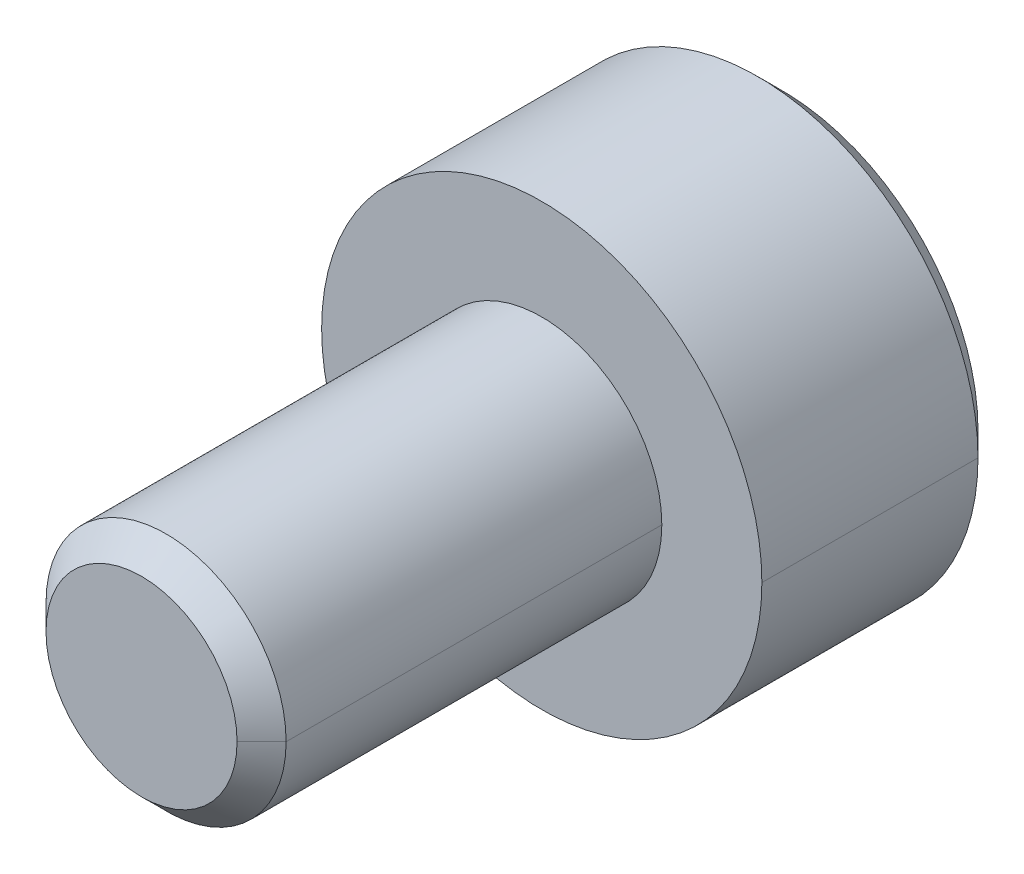
ISO-10303-21;
HEADER;
FILE_DESCRIPTION(('STEP AP214'),'2;1');
FILE_NAME('part.step','',(''),(''),'','','');
FILE_SCHEMA(('AUTOMOTIVE_DESIGN { 1 0 10303 214 1 1 1 1 }'));
ENDSEC;
DATA;
#1=APPLICATION_CONTEXT('core data for automotive mechanical design processes');
#2=APPLICATION_PROTOCOL_DEFINITION('international standard','automotive_design',2000,#1);
#3=PRODUCT_CONTEXT('',#1,'mechanical');
#4=PRODUCT('Part','Part','',(#3));
#5=PRODUCT_RELATED_PRODUCT_CATEGORY('part','',(#4));
#6=PRODUCT_DEFINITION_FORMATION('','',#4);
#7=PRODUCT_DEFINITION_CONTEXT('part definition',#1,'design');
#8=PRODUCT_DEFINITION('design','',#6,#7);
#9=PRODUCT_DEFINITION_SHAPE('','',#8);
#10=(LENGTH_UNIT() NAMED_UNIT(*) SI_UNIT(.MILLI.,.METRE.));
#11=(NAMED_UNIT(*) PLANE_ANGLE_UNIT() SI_UNIT($,.RADIAN.));
#12=(NAMED_UNIT(*) SI_UNIT($,.STERADIAN.) SOLID_ANGLE_UNIT());
#13=UNCERTAINTY_MEASURE_WITH_UNIT(LENGTH_MEASURE(1.E-05),#10,'distance_accuracy_value','');
#14=(GEOMETRIC_REPRESENTATION_CONTEXT(3) GLOBAL_UNCERTAINTY_ASSIGNED_CONTEXT((#13)) GLOBAL_UNIT_ASSIGNED_CONTEXT((#10,
#11,#12)) REPRESENTATION_CONTEXT('',''));
#15=CARTESIAN_POINT('',(0.,0.,0.));
#16=DIRECTION('',(0.,0.,1.));
#17=DIRECTION('',(1.,0.,0.));
#18=AXIS2_PLACEMENT_3D('',#15,#16,#17);
#19=CARTESIAN_POINT('',(0.,0.,1.3));
#20=DIRECTION('',(0.,0.,-1.));
#21=DIRECTION('',(0.,-1.,0.));
#22=AXIS2_PLACEMENT_3D('',#19,#20,#21);
#23=PLANE('',#22);
#24=DIRECTION('',(0.866025403784439,0.5,0.));
#25=VECTOR('',#24,1.);
#26=CARTESIAN_POINT('',(-1.25,0.721687836487033,1.3));
#27=LINE('',#26,#25);
#28=CARTESIAN_POINT('',(-1.25,0.721687836487033,1.3));
#29=VERTEX_POINT('',#28);
#30=CARTESIAN_POINT('',(0.,1.44337567297406,1.3));
#31=VERTEX_POINT('',#30);
#32=EDGE_CURVE('E251',#29,#31,#27,.T.);
#33=ORIENTED_EDGE('',*,*,#32,.T.);
#34=DIRECTION('',(0.866025403784439,-0.5,0.));
#35=VECTOR('',#34,1.);
#36=CARTESIAN_POINT('',(0.,1.44337567297406,1.3));
#37=LINE('',#36,#35);
#38=CARTESIAN_POINT('',(1.25,0.721687836487033,1.3));
#39=VERTEX_POINT('',#38);
#40=EDGE_CURVE('E9',#31,#39,#37,.T.);
#41=ORIENTED_EDGE('',*,*,#40,.T.);
#42=DIRECTION('',(0.,-1.,0.));
#43=VECTOR('',#42,1.);
#44=CARTESIAN_POINT('',(1.25,0.721687836487033,1.3));
#45=LINE('',#44,#43);
#46=CARTESIAN_POINT('',(1.25,-0.721687836487033,1.3));
#47=VERTEX_POINT('',#46);
#48=EDGE_CURVE('E42',#39,#47,#45,.T.);
#49=ORIENTED_EDGE('',*,*,#48,.T.);
#50=DIRECTION('',(-0.866025403784439,-0.5,0.));
#51=VECTOR('',#50,1.);
#52=CARTESIAN_POINT('',(1.25,-0.721687836487033,1.3));
#53=LINE('',#52,#51);
#54=CARTESIAN_POINT('',(0.,-1.44337567297406,1.3));
#55=VERTEX_POINT('',#54);
#56=EDGE_CURVE('E264',#47,#55,#53,.T.);
#57=ORIENTED_EDGE('',*,*,#56,.T.);
#58=DIRECTION('',(-0.866025403784439,0.5,0.));
#59=VECTOR('',#58,1.);
#60=CARTESIAN_POINT('',(0.,-1.44337567297406,1.3));
#61=LINE('',#60,#59);
#62=CARTESIAN_POINT('',(-1.25,-0.721687836487033,1.3));
#63=VERTEX_POINT('',#62);
#64=EDGE_CURVE('E258',#55,#63,#61,.T.);
#65=ORIENTED_EDGE('',*,*,#64,.T.);
#66=DIRECTION('',(0.,1.,0.));
#67=VECTOR('',#66,1.);
#68=CARTESIAN_POINT('',(-1.25,-0.721687836487033,1.3));
#69=LINE('',#68,#67);
#70=EDGE_CURVE('E210',#63,#29,#69,.T.);
#71=ORIENTED_EDGE('',*,*,#70,.T.);
#72=EDGE_LOOP('',(#33,#41,#49,#57,#65,#71));
#73=FACE_BOUND('',#72,.T.);
#74=ADVANCED_FACE('F15',(#73),#23,.T.);
#75=CARTESIAN_POINT('',(0.,1.44337567297406,1.3));
#76=DIRECTION('',(0.5,0.866025403784439,0.));
#77=DIRECTION('',(0.,0.,-1.));
#78=AXIS2_PLACEMENT_3D('',#75,#76,#77);
#79=PLANE('',#78);
#80=DIRECTION('',(0.866025403784439,-0.5,0.));
#81=VECTOR('',#80,1.);
#82=CARTESIAN_POINT('',(0.,1.44337567297406,0.));
#83=LINE('',#82,#81);
#84=CARTESIAN_POINT('',(0.,1.44337567297406,0.));
#85=VERTEX_POINT('',#84);
#86=CARTESIAN_POINT('',(1.25,0.721687836487033,0.));
#87=VERTEX_POINT('',#86);
#88=EDGE_CURVE('E228',#85,#87,#83,.T.);
#89=ORIENTED_EDGE('',*,*,#88,.T.);
#90=DIRECTION('',(0.,0.,-1.));
#91=VECTOR('',#90,1.);
#92=CARTESIAN_POINT('',(1.25,0.721687836487033,1.3));
#93=LINE('',#92,#91);
#94=EDGE_CURVE('E23',#39,#87,#93,.T.);
#95=ORIENTED_EDGE('',*,*,#94,.F.);
#96=ORIENTED_EDGE('',*,*,#40,.F.);
#97=DIRECTION('',(0.,0.,-1.));
#98=VECTOR('',#97,1.);
#99=CARTESIAN_POINT('',(0.,1.44337567297406,1.3));
#100=LINE('',#99,#98);
#101=EDGE_CURVE('E142',#31,#85,#100,.T.);
#102=ORIENTED_EDGE('',*,*,#101,.T.);
#103=EDGE_LOOP('',(#89,#95,#96,#102));
#104=FACE_BOUND('',#103,.T.);
#105=ADVANCED_FACE('F285',(#104),#79,.F.);
#106=CARTESIAN_POINT('',(1.25,0.721687836487033,1.3));
#107=DIRECTION('',(1.,0.,0.));
#108=DIRECTION('',(0.,1.,0.));
#109=AXIS2_PLACEMENT_3D('',#106,#107,#108);
#110=PLANE('',#109);
#111=DIRECTION('',(0.,-1.,0.));
#112=VECTOR('',#111,1.);
#113=CARTESIAN_POINT('',(1.25,0.721687836487033,0.));
#114=LINE('',#113,#112);
#115=CARTESIAN_POINT('',(1.25,-0.721687836487033,0.));
#116=VERTEX_POINT('',#115);
#117=EDGE_CURVE('E218',#87,#116,#114,.T.);
#118=ORIENTED_EDGE('',*,*,#117,.T.);
#119=DIRECTION('',(0.,0.,-1.));
#120=VECTOR('',#119,1.);
#121=CARTESIAN_POINT('',(1.25,-0.721687836487033,1.3));
#122=LINE('',#121,#120);
#123=EDGE_CURVE('E267',#47,#116,#122,.T.);
#124=ORIENTED_EDGE('',*,*,#123,.F.);
#125=ORIENTED_EDGE('',*,*,#48,.F.);
#126=ORIENTED_EDGE('',*,*,#94,.T.);
#127=EDGE_LOOP('',(#118,#124,#125,#126));
#128=FACE_BOUND('',#127,.T.);
#129=ADVANCED_FACE('F276',(#128),#110,.F.);
#130=CARTESIAN_POINT('',(1.25,-0.721687836487033,1.3));
#131=DIRECTION('',(0.5,-0.866025403784439,0.));
#132=DIRECTION('',(0.,0.,-1.));
#133=AXIS2_PLACEMENT_3D('',#130,#131,#132);
#134=PLANE('',#133);
#135=DIRECTION('',(-0.866025403784439,-0.5,0.));
#136=VECTOR('',#135,1.);
#137=CARTESIAN_POINT('',(1.25,-0.721687836487033,0.));
#138=LINE('',#137,#136);
#139=CARTESIAN_POINT('',(0.,-1.44337567297406,0.));
#140=VERTEX_POINT('',#139);
#141=EDGE_CURVE('E222',#116,#140,#138,.T.);
#142=ORIENTED_EDGE('',*,*,#141,.T.);
#143=DIRECTION('',(0.,0.,-1.));
#144=VECTOR('',#143,1.);
#145=CARTESIAN_POINT('',(0.,-1.44337567297406,1.3));
#146=LINE('',#145,#144);
#147=EDGE_CURVE('E261',#55,#140,#146,.T.);
#148=ORIENTED_EDGE('',*,*,#147,.F.);
#149=ORIENTED_EDGE('',*,*,#56,.F.);
#150=ORIENTED_EDGE('',*,*,#123,.T.);
#151=EDGE_LOOP('',(#142,#148,#149,#150));
#152=FACE_BOUND('',#151,.T.);
#153=ADVANCED_FACE('F302',(#152),#134,.F.);
#154=CARTESIAN_POINT('',(0.,-1.44337567297406,1.3));
#155=DIRECTION('',(-0.5,-0.866025403784439,0.));
#156=DIRECTION('',(-0.866025403784439,0.5,0.));
#157=AXIS2_PLACEMENT_3D('',#154,#155,#156);
#158=PLANE('',#157);
#159=DIRECTION('',(-0.866025403784439,0.5,0.));
#160=VECTOR('',#159,1.);
#161=CARTESIAN_POINT('',(0.,-1.44337567297406,0.));
#162=LINE('',#161,#160);
#163=CARTESIAN_POINT('',(-1.25,-0.721687836487033,0.));
#164=VERTEX_POINT('',#163);
#165=EDGE_CURVE('E240',#140,#164,#162,.T.);
#166=ORIENTED_EDGE('',*,*,#165,.T.);
#167=DIRECTION('',(0.,0.,-1.));
#168=VECTOR('',#167,1.);
#169=CARTESIAN_POINT('',(-1.25,-0.721687836487033,1.3));
#170=LINE('',#169,#168);
#171=EDGE_CURVE('E213',#63,#164,#170,.T.);
#172=ORIENTED_EDGE('',*,*,#171,.F.);
#173=ORIENTED_EDGE('',*,*,#64,.F.);
#174=ORIENTED_EDGE('',*,*,#147,.T.);
#175=EDGE_LOOP('',(#166,#172,#173,#174));
#176=FACE_BOUND('',#175,.T.);
#177=ADVANCED_FACE('F298',(#176),#158,.F.);
#178=CARTESIAN_POINT('',(-1.25,-0.721687836487033,1.3));
#179=DIRECTION('',(-1.,0.,0.));
#180=DIRECTION('',(0.,0.,1.));
#181=AXIS2_PLACEMENT_3D('',#178,#179,#180);
#182=PLANE('',#181);
#183=DIRECTION('',(0.,1.,0.));
#184=VECTOR('',#183,1.);
#185=CARTESIAN_POINT('',(-1.25,-0.721687836487033,0.));
#186=LINE('',#185,#184);
#187=CARTESIAN_POINT('',(-1.25,0.721687836487033,0.));
#188=VERTEX_POINT('',#187);
#189=EDGE_CURVE('E236',#164,#188,#186,.T.);
#190=ORIENTED_EDGE('',*,*,#189,.T.);
#191=DIRECTION('',(0.,0.,-1.));
#192=VECTOR('',#191,1.);
#193=CARTESIAN_POINT('',(-1.25,0.721687836487033,1.3));
#194=LINE('',#193,#192);
#195=EDGE_CURVE('E214',#29,#188,#194,.T.);
#196=ORIENTED_EDGE('',*,*,#195,.F.);
#197=ORIENTED_EDGE('',*,*,#70,.F.);
#198=ORIENTED_EDGE('',*,*,#171,.T.);
#199=EDGE_LOOP('',(#190,#196,#197,#198));
#200=FACE_BOUND('',#199,.T.);
#201=ADVANCED_FACE('F293',(#200),#182,.F.);
#202=CARTESIAN_POINT('',(-1.25,0.721687836487033,1.3));
#203=DIRECTION('',(-0.5,0.866025403784439,0.));
#204=DIRECTION('',(0.,0.,1.));
#205=AXIS2_PLACEMENT_3D('',#202,#203,#204);
#206=PLANE('',#205);
#207=DIRECTION('',(0.866025403784439,0.5,0.));
#208=VECTOR('',#207,1.);
#209=CARTESIAN_POINT('',(-1.25,0.721687836487033,0.));
#210=LINE('',#209,#208);
#211=EDGE_CURVE('E232',#188,#85,#210,.T.);
#212=ORIENTED_EDGE('',*,*,#211,.T.);
#213=ORIENTED_EDGE('',*,*,#101,.F.);
#214=ORIENTED_EDGE('',*,*,#32,.F.);
#215=ORIENTED_EDGE('',*,*,#195,.T.);
#216=EDGE_LOOP('',(#212,#213,#214,#215));
#217=FACE_BOUND('',#216,.T.);
#218=ADVANCED_FACE('F289',(#217),#206,.F.);
#219=CARTESIAN_POINT('',(0.,0.,8.));
#220=DIRECTION('',(0.,0.,-1.));
#221=DIRECTION('',(-1.,0.,0.));
#222=AXIS2_PLACEMENT_3D('',#219,#220,#221);
#223=CONICAL_SURFACE('',#222,1.1935,0.785398163397443);
#224=DIRECTION('',(0.707106781186544,0.,-0.707106781186551));
#225=VECTOR('',#224,1.);
#226=CARTESIAN_POINT('',(1.1935,0.,8.));
#227=LINE('',#226,#225);
#228=CARTESIAN_POINT('',(1.1935,0.,8.));
#229=VERTEX_POINT('',#228);
#230=CARTESIAN_POINT('',(1.5,0.,7.6935));
#231=VERTEX_POINT('',#230);
#232=EDGE_CURVE('E146',#229,#231,#227,.T.);
#233=ORIENTED_EDGE('',*,*,#232,.F.);
#234=CARTESIAN_POINT('',(0.,0.,8.));
#235=DIRECTION('',(0.,0.,1.));
#236=DIRECTION('',(1.,0.,0.));
#237=AXIS2_PLACEMENT_3D('',#234,#235,#236);
#238=CIRCLE('',#237,1.1935);
#239=CARTESIAN_POINT('',(-1.1935,0.,8.));
#240=VERTEX_POINT('',#239);
#241=EDGE_CURVE('E133',#240,#229,#238,.T.);
#242=ORIENTED_EDGE('',*,*,#241,.F.);
#243=DIRECTION('',(-0.707106781186544,0.,-0.707106781186551));
#244=VECTOR('',#243,1.);
#245=CARTESIAN_POINT('',(-1.1935,0.,8.));
#246=LINE('',#245,#244);
#247=CARTESIAN_POINT('',(-1.5,0.,7.6935));
#248=VERTEX_POINT('',#247);
#249=EDGE_CURVE('E155',#240,#248,#246,.T.);
#250=ORIENTED_EDGE('',*,*,#249,.T.);
#251=CARTESIAN_POINT('',(0.,0.,7.6935));
#252=DIRECTION('',(0.,0.,-1.));
#253=DIRECTION('',(1.,0.,0.));
#254=AXIS2_PLACEMENT_3D('',#251,#252,#253);
#255=CIRCLE('',#254,1.5);
#256=EDGE_CURVE('E143',#231,#248,#255,.T.);
#257=ORIENTED_EDGE('',*,*,#256,.F.);
#258=EDGE_LOOP('',(#233,#242,#250,#257));
#259=FACE_BOUND('',#258,.T.);
#260=ADVANCED_FACE('F147',(#259),#223,.T.);
#261=CARTESIAN_POINT('',(0.,0.,0.3));
#262=DIRECTION('',(0.,0.,1.));
#263=DIRECTION('',(1.,0.,0.));
#264=AXIS2_PLACEMENT_3D('',#261,#262,#263);
#265=CONICAL_SURFACE('',#264,2.75,0.785398163397448);
#266=DIRECTION('',(-0.707106781186548,0.,0.707106781186548));
#267=VECTOR('',#266,1.);
#268=CARTESIAN_POINT('',(-2.75,0.,0.3));
#269=LINE('',#268,#267);
#270=CARTESIAN_POINT('',(-2.45,0.,0.));
#271=VERTEX_POINT('',#270);
#272=CARTESIAN_POINT('',(-2.75,0.,0.3));
#273=VERTEX_POINT('',#272);
#274=EDGE_CURVE('E170',#271,#273,#269,.T.);
#275=ORIENTED_EDGE('',*,*,#274,.F.);
#276=CARTESIAN_POINT('',(0.,0.,0.));
#277=DIRECTION('',(0.,0.,-1.));
#278=DIRECTION('',(1.,0.,0.));
#279=AXIS2_PLACEMENT_3D('',#276,#277,#278);
#280=CIRCLE('',#279,2.45);
#281=CARTESIAN_POINT('',(2.45,0.,0.));
#282=VERTEX_POINT('',#281);
#283=EDGE_CURVE('E225',#282,#271,#280,.T.);
#284=ORIENTED_EDGE('',*,*,#283,.F.);
#285=DIRECTION('',(0.707106781186548,0.,0.707106781186548));
#286=VECTOR('',#285,1.);
#287=CARTESIAN_POINT('',(2.75,0.,0.3));
#288=LINE('',#287,#286);
#289=CARTESIAN_POINT('',(2.75,0.,0.3));
#290=VERTEX_POINT('',#289);
#291=EDGE_CURVE('E184',#282,#290,#288,.T.);
#292=ORIENTED_EDGE('',*,*,#291,.T.);
#293=CARTESIAN_POINT('',(0.,0.,0.3));
#294=DIRECTION('',(0.,0.,1.));
#295=DIRECTION('',(1.,0.,0.));
#296=AXIS2_PLACEMENT_3D('',#293,#294,#295);
#297=CIRCLE('',#296,2.75);
#298=EDGE_CURVE('E206',#273,#290,#297,.T.);
#299=ORIENTED_EDGE('',*,*,#298,.F.);
#300=EDGE_LOOP('',(#275,#284,#292,#299));
#301=FACE_BOUND('',#300,.T.);
#302=ADVANCED_FACE('F319',(#301),#265,.T.);
#303=CARTESIAN_POINT('',(0.,0.,8.));
#304=DIRECTION('',(0.,0.,1.));
#305=DIRECTION('',(1.,0.,0.));
#306=AXIS2_PLACEMENT_3D('',#303,#304,#305);
#307=PLANE('',#306);
#308=ORIENTED_EDGE('',*,*,#241,.T.);
#309=CARTESIAN_POINT('',(0.,0.,8.));
#310=DIRECTION('',(0.,0.,1.));
#311=DIRECTION('',(1.,0.,0.));
#312=AXIS2_PLACEMENT_3D('',#309,#310,#311);
#313=CIRCLE('',#312,1.1935);
#314=EDGE_CURVE('E137',#229,#240,#313,.T.);
#315=ORIENTED_EDGE('',*,*,#314,.T.);
#316=EDGE_LOOP('',(#308,#315));
#317=FACE_BOUND('',#316,.T.);
#318=ADVANCED_FACE('F135',(#317),#307,.T.);
#319=CARTESIAN_POINT('',(0.,0.,8.));
#320=DIRECTION('',(0.,0.,-1.));
#321=DIRECTION('',(-1.,0.,0.));
#322=AXIS2_PLACEMENT_3D('',#319,#320,#321);
#323=CYLINDRICAL_SURFACE('',#322,1.5);
#324=DIRECTION('',(0.,0.,-1.));
#325=VECTOR('',#324,1.);
#326=CARTESIAN_POINT('',(1.5,0.,8.));
#327=LINE('',#326,#325);
#328=CARTESIAN_POINT('',(1.5,0.,3.));
#329=VERTEX_POINT('',#328);
#330=EDGE_CURVE('E179',#231,#329,#327,.T.);
#331=ORIENTED_EDGE('',*,*,#330,.F.);
#332=ORIENTED_EDGE('',*,*,#256,.T.);
#333=DIRECTION('',(0.,0.,-1.));
#334=VECTOR('',#333,1.);
#335=CARTESIAN_POINT('',(-1.5,0.,8.));
#336=LINE('',#335,#334);
#337=CARTESIAN_POINT('',(-1.5,0.,3.));
#338=VERTEX_POINT('',#337);
#339=EDGE_CURVE('E199',#248,#338,#336,.T.);
#340=ORIENTED_EDGE('',*,*,#339,.T.);
#341=CARTESIAN_POINT('',(0.,0.,3.));
#342=DIRECTION('',(0.,0.,1.));
#343=DIRECTION('',(1.,0.,0.));
#344=AXIS2_PLACEMENT_3D('',#341,#342,#343);
#345=CIRCLE('',#344,1.5);
#346=EDGE_CURVE('E209',#338,#329,#345,.T.);
#347=ORIENTED_EDGE('',*,*,#346,.T.);
#348=EDGE_LOOP('',(#331,#332,#340,#347));
#349=FACE_BOUND('',#348,.T.);
#350=ADVANCED_FACE('F323',(#349),#323,.T.);
#351=CARTESIAN_POINT('',(0.,0.,0.));
#352=DIRECTION('',(0.,0.,1.));
#353=DIRECTION('',(1.,0.,0.));
#354=AXIS2_PLACEMENT_3D('',#351,#352,#353);
#355=PLANE('',#354);
#356=ORIENTED_EDGE('',*,*,#88,.F.);
#357=ORIENTED_EDGE('',*,*,#211,.F.);
#358=ORIENTED_EDGE('',*,*,#189,.F.);
#359=ORIENTED_EDGE('',*,*,#165,.F.);
#360=ORIENTED_EDGE('',*,*,#141,.F.);
#361=ORIENTED_EDGE('',*,*,#117,.F.);
#362=EDGE_LOOP('',(#356,#357,#358,#359,#360,#361));
#363=FACE_BOUND('',#362,.T.);
#364=ORIENTED_EDGE('',*,*,#283,.T.);
#365=CARTESIAN_POINT('',(0.,0.,0.));
#366=DIRECTION('',(0.,0.,-1.));
#367=DIRECTION('',(1.,0.,0.));
#368=AXIS2_PLACEMENT_3D('',#365,#366,#367);
#369=CIRCLE('',#368,2.45);
#370=EDGE_CURVE('E175',#271,#282,#369,.T.);
#371=ORIENTED_EDGE('',*,*,#370,.T.);
#372=EDGE_LOOP('',(#364,#371));
#373=FACE_BOUND('',#372,.T.);
#374=ADVANCED_FACE('F281',(#363,#373),#355,.F.);
#375=CARTESIAN_POINT('',(0.,0.,3.));
#376=DIRECTION('',(0.,0.,1.));
#377=DIRECTION('',(1.,0.,0.));
#378=AXIS2_PLACEMENT_3D('',#375,#376,#377);
#379=PLANE('',#378);
#380=ORIENTED_EDGE('',*,*,#346,.F.);
#381=CARTESIAN_POINT('',(0.,0.,3.));
#382=DIRECTION('',(0.,0.,1.));
#383=DIRECTION('',(1.,0.,0.));
#384=AXIS2_PLACEMENT_3D('',#381,#382,#383);
#385=CIRCLE('',#384,1.5);
#386=EDGE_CURVE('E183',#329,#338,#385,.T.);
#387=ORIENTED_EDGE('',*,*,#386,.F.);
#388=EDGE_LOOP('',(#380,#387));
#389=FACE_BOUND('',#388,.T.);
#390=CARTESIAN_POINT('',(0.,0.,3.));
#391=DIRECTION('',(0.,0.,1.));
#392=DIRECTION('',(1.,0.,0.));
#393=AXIS2_PLACEMENT_3D('',#390,#391,#392);
#394=CIRCLE('',#393,2.75);
#395=CARTESIAN_POINT('',(-2.75,0.,3.));
#396=VERTEX_POINT('',#395);
#397=CARTESIAN_POINT('',(2.75,0.,3.));
#398=VERTEX_POINT('',#397);
#399=EDGE_CURVE('E162',#396,#398,#394,.T.);
#400=ORIENTED_EDGE('',*,*,#399,.T.);
#401=CARTESIAN_POINT('',(0.,0.,3.));
#402=DIRECTION('',(0.,0.,1.));
#403=DIRECTION('',(1.,0.,0.));
#404=AXIS2_PLACEMENT_3D('',#401,#402,#403);
#405=CIRCLE('',#404,2.75);
#406=EDGE_CURVE('E169',#398,#396,#405,.T.);
#407=ORIENTED_EDGE('',*,*,#406,.T.);
#408=EDGE_LOOP('',(#400,#407));
#409=FACE_BOUND('',#408,.T.);
#410=ADVANCED_FACE('F329',(#389,#409),#379,.T.);
#411=CARTESIAN_POINT('',(0.,0.,3.));
#412=DIRECTION('',(0.,0.,-1.));
#413=DIRECTION('',(-1.,0.,0.));
#414=AXIS2_PLACEMENT_3D('',#411,#412,#413);
#415=CYLINDRICAL_SURFACE('',#414,2.75);
#416=DIRECTION('',(0.,0.,-1.));
#417=VECTOR('',#416,1.);
#418=CARTESIAN_POINT('',(2.75,0.,3.));
#419=LINE('',#418,#417);
#420=EDGE_CURVE('E164',#398,#290,#419,.T.);
#421=ORIENTED_EDGE('',*,*,#420,.F.);
#422=ORIENTED_EDGE('',*,*,#399,.F.);
#423=DIRECTION('',(0.,0.,-1.));
#424=VECTOR('',#423,1.);
#425=CARTESIAN_POINT('',(-2.75,0.,3.));
#426=LINE('',#425,#424);
#427=EDGE_CURVE('E168',#396,#273,#426,.T.);
#428=ORIENTED_EDGE('',*,*,#427,.T.);
#429=ORIENTED_EDGE('',*,*,#298,.T.);
#430=EDGE_LOOP('',(#421,#422,#428,#429));
#431=FACE_BOUND('',#430,.T.);
#432=ADVANCED_FACE('F334',(#431),#415,.T.);
#433=CARTESIAN_POINT('',(0.,0.,3.));
#434=DIRECTION('',(0.,0.,-1.));
#435=DIRECTION('',(-1.,0.,0.));
#436=AXIS2_PLACEMENT_3D('',#433,#434,#435);
#437=CYLINDRICAL_SURFACE('',#436,2.75);
#438=ORIENTED_EDGE('',*,*,#406,.F.);
#439=ORIENTED_EDGE('',*,*,#420,.T.);
#440=CARTESIAN_POINT('',(0.,0.,0.3));
#441=DIRECTION('',(0.,0.,1.));
#442=DIRECTION('',(1.,0.,0.));
#443=AXIS2_PLACEMENT_3D('',#440,#441,#442);
#444=CIRCLE('',#443,2.75);
#445=EDGE_CURVE('E174',#290,#273,#444,.T.);
#446=ORIENTED_EDGE('',*,*,#445,.T.);
#447=ORIENTED_EDGE('',*,*,#427,.F.);
#448=EDGE_LOOP('',(#438,#439,#446,#447));
#449=FACE_BOUND('',#448,.T.);
#450=ADVANCED_FACE('F338',(#449),#437,.T.);
#451=CARTESIAN_POINT('',(0.,0.,8.));
#452=DIRECTION('',(0.,0.,-1.));
#453=DIRECTION('',(-1.,0.,0.));
#454=AXIS2_PLACEMENT_3D('',#451,#452,#453);
#455=CYLINDRICAL_SURFACE('',#454,1.5);
#456=CARTESIAN_POINT('',(0.,0.,7.6935));
#457=DIRECTION('',(0.,0.,-1.));
#458=DIRECTION('',(1.,0.,0.));
#459=AXIS2_PLACEMENT_3D('',#456,#457,#458);
#460=CIRCLE('',#459,1.5);
#461=EDGE_CURVE('E152',#248,#231,#460,.T.);
#462=ORIENTED_EDGE('',*,*,#461,.T.);
#463=ORIENTED_EDGE('',*,*,#330,.T.);
#464=ORIENTED_EDGE('',*,*,#386,.T.);
#465=ORIENTED_EDGE('',*,*,#339,.F.);
#466=EDGE_LOOP('',(#462,#463,#464,#465));
#467=FACE_BOUND('',#466,.T.);
#468=ADVANCED_FACE('F344',(#467),#455,.T.);
#469=CARTESIAN_POINT('',(0.,0.,0.3));
#470=DIRECTION('',(0.,0.,1.));
#471=DIRECTION('',(1.,0.,0.));
#472=AXIS2_PLACEMENT_3D('',#469,#470,#471);
#473=CONICAL_SURFACE('',#472,2.75,0.785398163397448);
#474=ORIENTED_EDGE('',*,*,#370,.F.);
#475=ORIENTED_EDGE('',*,*,#274,.T.);
#476=ORIENTED_EDGE('',*,*,#445,.F.);
#477=ORIENTED_EDGE('',*,*,#291,.F.);
#478=EDGE_LOOP('',(#474,#475,#476,#477));
#479=FACE_BOUND('',#478,.T.);
#480=ADVANCED_FACE('F348',(#479),#473,.T.);
#481=CARTESIAN_POINT('',(0.,0.,8.));
#482=DIRECTION('',(0.,0.,-1.));
#483=DIRECTION('',(-1.,0.,0.));
#484=AXIS2_PLACEMENT_3D('',#481,#482,#483);
#485=CONICAL_SURFACE('',#484,1.1935,0.785398163397443);
#486=ORIENTED_EDGE('',*,*,#314,.F.);
#487=ORIENTED_EDGE('',*,*,#232,.T.);
#488=ORIENTED_EDGE('',*,*,#461,.F.);
#489=ORIENTED_EDGE('',*,*,#249,.F.);
#490=EDGE_LOOP('',(#486,#487,#488,#489));
#491=FACE_BOUND('',#490,.T.);
#492=ADVANCED_FACE('F154',(#491),#485,.T.);
#493=CLOSED_SHELL('',(#74,#105,#129,#153,#177,#201,#218,#260,#302,#318,#350,#374,#410,#432,#450,
#468,#480,#492));
#494=MANIFOLD_SOLID_BREP('B1',#493);
#495=ADVANCED_BREP_SHAPE_REPRESENTATION('',(#18,#494),#14);
#496=SHAPE_DEFINITION_REPRESENTATION(#9,#495);
ENDSEC;
END-ISO-10303-21;
